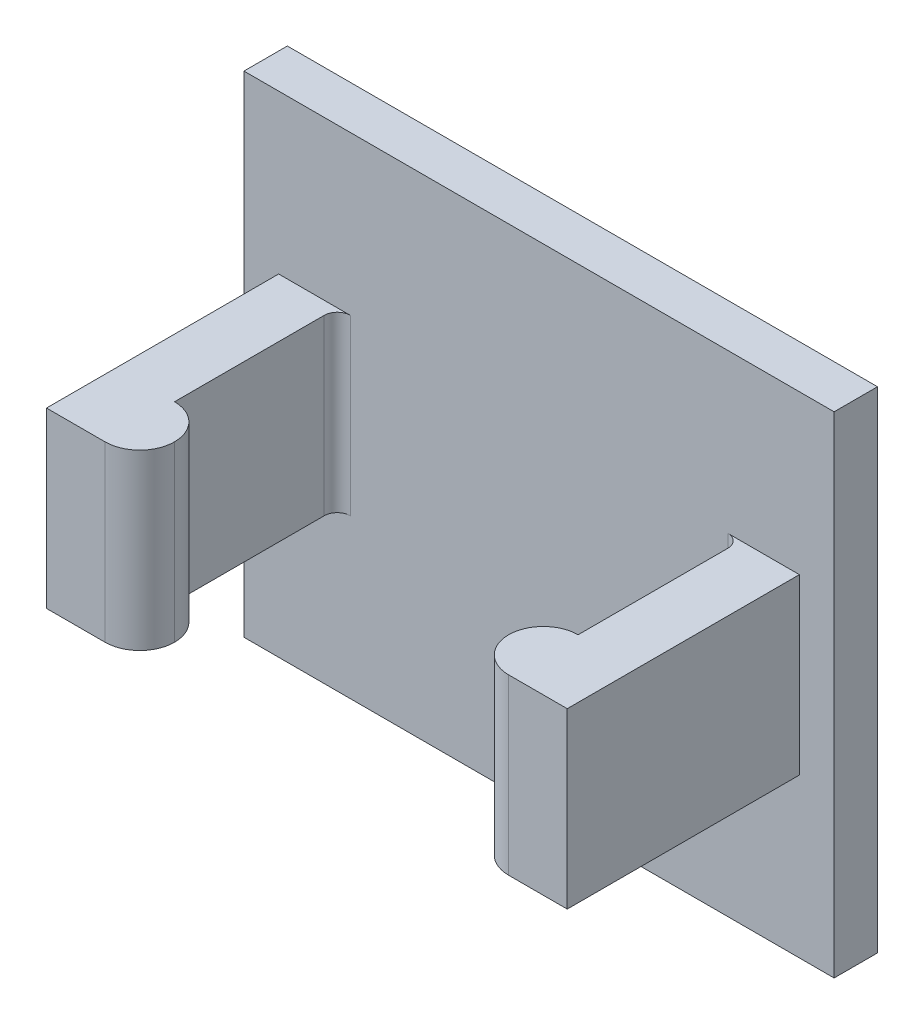
ISO-10303-21;
HEADER;
FILE_DESCRIPTION(('STEP AP214'),'2;1');
FILE_NAME('part.step','',(''),(''),'','','');
FILE_SCHEMA(('AUTOMOTIVE_DESIGN { 1 0 10303 214 1 1 1 1 }'));
ENDSEC;
DATA;
#1=APPLICATION_CONTEXT('core data for automotive mechanical design processes');
#2=APPLICATION_PROTOCOL_DEFINITION('international standard','automotive_design',2000,#1);
#3=PRODUCT_CONTEXT('',#1,'mechanical');
#4=PRODUCT('Part','Part','',(#3));
#5=PRODUCT_RELATED_PRODUCT_CATEGORY('part','',(#4));
#6=PRODUCT_DEFINITION_FORMATION('','',#4);
#7=PRODUCT_DEFINITION_CONTEXT('part definition',#1,'design');
#8=PRODUCT_DEFINITION('design','',#6,#7);
#9=PRODUCT_DEFINITION_SHAPE('','',#8);
#10=(LENGTH_UNIT() NAMED_UNIT(*) SI_UNIT(.MILLI.,.METRE.));
#11=(NAMED_UNIT(*) PLANE_ANGLE_UNIT() SI_UNIT($,.RADIAN.));
#12=(NAMED_UNIT(*) SI_UNIT($,.STERADIAN.) SOLID_ANGLE_UNIT());
#13=UNCERTAINTY_MEASURE_WITH_UNIT(LENGTH_MEASURE(1.E-05),#10,'distance_accuracy_value','');
#14=(GEOMETRIC_REPRESENTATION_CONTEXT(3) GLOBAL_UNCERTAINTY_ASSIGNED_CONTEXT((#13)) GLOBAL_UNIT_ASSIGNED_CONTEXT((#10,
#11,#12)) REPRESENTATION_CONTEXT('',''));
#15=CARTESIAN_POINT('',(0.,0.,0.));
#16=DIRECTION('',(0.,0.,1.));
#17=DIRECTION('',(1.,0.,0.));
#18=AXIS2_PLACEMENT_3D('',#15,#16,#17);
#19=CARTESIAN_POINT('',(6.,-5.65,1.));
#20=DIRECTION('',(-1.,0.,0.));
#21=DIRECTION('',(0.,0.,1.));
#22=AXIS2_PLACEMENT_3D('',#19,#20,#21);
#23=PLANE('',#22);
#24=DIRECTION('',(0.,-1.,0.));
#25=VECTOR('',#24,1.);
#26=CARTESIAN_POINT('',(6.,5.65,1.));
#27=LINE('',#26,#25);
#28=CARTESIAN_POINT('',(6.,2.,1.));
#29=VERTEX_POINT('',#28);
#30=CARTESIAN_POINT('',(6.,-2.,1.));
#31=VERTEX_POINT('',#30);
#32=EDGE_CURVE('E11',#29,#31,#27,.T.);
#33=ORIENTED_EDGE('',*,*,#32,.F.);
#34=DIRECTION('',(0.,0.,-1.));
#35=VECTOR('',#34,1.);
#36=CARTESIAN_POINT('',(6.,2.,6.35));
#37=LINE('',#36,#35);
#38=CARTESIAN_POINT('',(6.,2.,6.35));
#39=VERTEX_POINT('',#38);
#40=EDGE_CURVE('E261',#39,#29,#37,.T.);
#41=ORIENTED_EDGE('',*,*,#40,.F.);
#42=DIRECTION('',(0.,1.,0.));
#43=VECTOR('',#42,1.);
#44=CARTESIAN_POINT('',(6.,2.,6.35));
#45=LINE('',#44,#43);
#46=CARTESIAN_POINT('',(6.,-2.,6.35));
#47=VERTEX_POINT('',#46);
#48=EDGE_CURVE('E232',#47,#39,#45,.T.);
#49=ORIENTED_EDGE('',*,*,#48,.F.);
#50=DIRECTION('',(0.,0.,-1.));
#51=VECTOR('',#50,1.);
#52=CARTESIAN_POINT('',(6.,-2.,6.35));
#53=LINE('',#52,#51);
#54=EDGE_CURVE('E244',#47,#31,#53,.T.);
#55=ORIENTED_EDGE('',*,*,#54,.T.);
#56=EDGE_LOOP('',(#33,#41,#49,#55));
#57=FACE_BOUND('',#56,.T.);
#58=ADVANCED_FACE('F41',(#57),#23,.F.);
#59=CARTESIAN_POINT('',(-6.,-5.65,1.));
#60=DIRECTION('',(1.,0.,0.));
#61=DIRECTION('',(0.,0.,-1.));
#62=AXIS2_PLACEMENT_3D('',#59,#60,#61);
#63=PLANE('',#62);
#64=DIRECTION('',(0.,1.,0.));
#65=VECTOR('',#64,1.);
#66=CARTESIAN_POINT('',(-6.,5.65,1.));
#67=LINE('',#66,#65);
#68=CARTESIAN_POINT('',(-6.,-2.,1.));
#69=VERTEX_POINT('',#68);
#70=CARTESIAN_POINT('',(-6.,2.,1.));
#71=VERTEX_POINT('',#70);
#72=EDGE_CURVE('E51',#69,#71,#67,.T.);
#73=ORIENTED_EDGE('',*,*,#72,.F.);
#74=DIRECTION('',(0.,0.,-1.));
#75=VECTOR('',#74,1.);
#76=CARTESIAN_POINT('',(-6.,-2.,6.35));
#77=LINE('',#76,#75);
#78=CARTESIAN_POINT('',(-6.,-2.,6.35));
#79=VERTEX_POINT('',#78);
#80=EDGE_CURVE('E294',#79,#69,#77,.T.);
#81=ORIENTED_EDGE('',*,*,#80,.F.);
#82=DIRECTION('',(0.,-1.,0.));
#83=VECTOR('',#82,1.);
#84=CARTESIAN_POINT('',(-6.,2.,6.35));
#85=LINE('',#84,#83);
#86=CARTESIAN_POINT('',(-6.,2.,6.35));
#87=VERTEX_POINT('',#86);
#88=EDGE_CURVE('E266',#87,#79,#85,.T.);
#89=ORIENTED_EDGE('',*,*,#88,.F.);
#90=DIRECTION('',(0.,0.,-1.));
#91=VECTOR('',#90,1.);
#92=CARTESIAN_POINT('',(-6.,2.,6.35));
#93=LINE('',#92,#91);
#94=EDGE_CURVE('E278',#87,#71,#93,.T.);
#95=ORIENTED_EDGE('',*,*,#94,.T.);
#96=EDGE_LOOP('',(#73,#81,#89,#95));
#97=FACE_BOUND('',#96,.T.);
#98=ADVANCED_FACE('F374',(#97),#63,.F.);
#99=CARTESIAN_POINT('',(4.65,2.,6.35));
#100=DIRECTION('',(1.,0.,0.));
#101=DIRECTION('',(0.,0.,-1.));
#102=AXIS2_PLACEMENT_3D('',#99,#100,#101);
#103=PLANE('',#102);
#104=DIRECTION('',(0.,0.,-1.));
#105=VECTOR('',#104,1.);
#106=CARTESIAN_POINT('',(4.65,2.,6.35));
#107=LINE('',#106,#105);
#108=CARTESIAN_POINT('',(4.65,2.,4.75));
#109=VERTEX_POINT('',#108);
#110=CARTESIAN_POINT('',(4.65,2.,1.3));
#111=VERTEX_POINT('',#110);
#112=EDGE_CURVE('E257',#109,#111,#107,.T.);
#113=ORIENTED_EDGE('',*,*,#112,.T.);
#114=DIRECTION('',(0.,-1.,0.));
#115=VECTOR('',#114,1.);
#116=CARTESIAN_POINT('',(4.65,-2.,1.3));
#117=LINE('',#116,#115);
#118=CARTESIAN_POINT('',(4.65,-2.,1.3));
#119=VERTEX_POINT('',#118);
#120=EDGE_CURVE('E336',#111,#119,#117,.T.);
#121=ORIENTED_EDGE('',*,*,#120,.T.);
#122=DIRECTION('',(0.,0.,-1.));
#123=VECTOR('',#122,1.);
#124=CARTESIAN_POINT('',(4.65,-2.,6.35));
#125=LINE('',#124,#123);
#126=CARTESIAN_POINT('',(4.65,-2.,4.75));
#127=VERTEX_POINT('',#126);
#128=EDGE_CURVE('E253',#127,#119,#125,.T.);
#129=ORIENTED_EDGE('',*,*,#128,.F.);
#130=DIRECTION('',(0.,-1.,0.));
#131=VECTOR('',#130,1.);
#132=CARTESIAN_POINT('',(4.65,2.,4.75));
#133=LINE('',#132,#131);
#134=EDGE_CURVE('E222',#109,#127,#133,.T.);
#135=ORIENTED_EDGE('',*,*,#134,.F.);
#136=EDGE_LOOP('',(#113,#121,#129,#135));
#137=FACE_BOUND('',#136,.T.);
#138=ADVANCED_FACE('F408',(#137),#103,.F.);
#139=CARTESIAN_POINT('',(-4.65,2.,6.35));
#140=DIRECTION('',(-1.,0.,0.));
#141=DIRECTION('',(0.,0.,1.));
#142=AXIS2_PLACEMENT_3D('',#139,#140,#141);
#143=PLANE('',#142);
#144=DIRECTION('',(0.,0.,-1.));
#145=VECTOR('',#144,1.);
#146=CARTESIAN_POINT('',(-4.65,-2.,6.35));
#147=LINE('',#146,#145);
#148=CARTESIAN_POINT('',(-4.65,-2.,4.75));
#149=VERTEX_POINT('',#148);
#150=CARTESIAN_POINT('',(-4.65,-2.,1.3));
#151=VERTEX_POINT('',#150);
#152=EDGE_CURVE('E291',#149,#151,#147,.T.);
#153=ORIENTED_EDGE('',*,*,#152,.T.);
#154=DIRECTION('',(0.,1.,0.));
#155=VECTOR('',#154,1.);
#156=CARTESIAN_POINT('',(-4.65,2.,1.3));
#157=LINE('',#156,#155);
#158=CARTESIAN_POINT('',(-4.65,2.,1.3));
#159=VERTEX_POINT('',#158);
#160=EDGE_CURVE('E354',#151,#159,#157,.T.);
#161=ORIENTED_EDGE('',*,*,#160,.T.);
#162=DIRECTION('',(0.,0.,-1.));
#163=VECTOR('',#162,1.);
#164=CARTESIAN_POINT('',(-4.65,2.,6.35));
#165=LINE('',#164,#163);
#166=CARTESIAN_POINT('',(-4.65,2.,4.75));
#167=VERTEX_POINT('',#166);
#168=EDGE_CURVE('E287',#167,#159,#165,.T.);
#169=ORIENTED_EDGE('',*,*,#168,.F.);
#170=DIRECTION('',(0.,1.,0.));
#171=VECTOR('',#170,1.);
#172=CARTESIAN_POINT('',(-4.65,2.,4.75));
#173=LINE('',#172,#171);
#174=EDGE_CURVE('E226',#149,#167,#173,.T.);
#175=ORIENTED_EDGE('',*,*,#174,.F.);
#176=EDGE_LOOP('',(#153,#161,#169,#175));
#177=FACE_BOUND('',#176,.T.);
#178=ADVANCED_FACE('F388',(#177),#143,.F.);
#179=CARTESIAN_POINT('',(0.,0.,1.));
#180=DIRECTION('',(0.,0.,-1.));
#181=DIRECTION('',(-1.,0.,0.));
#182=AXIS2_PLACEMENT_3D('',#179,#180,#181);
#183=PLANE('',#182);
#184=DIRECTION('',(0.,-1.,0.));
#185=VECTOR('',#184,1.);
#186=CARTESIAN_POINT('',(6.8,5.65,1.));
#187=LINE('',#186,#185);
#188=CARTESIAN_POINT('',(6.8,5.65,1.));
#189=VERTEX_POINT('',#188);
#190=CARTESIAN_POINT('',(6.8,-5.65,1.));
#191=VERTEX_POINT('',#190);
#192=EDGE_CURVE('E175',#189,#191,#187,.T.);
#193=ORIENTED_EDGE('',*,*,#192,.F.);
#194=DIRECTION('',(-1.,0.,0.));
#195=VECTOR('',#194,1.);
#196=CARTESIAN_POINT('',(-6.,5.65,1.));
#197=LINE('',#196,#195);
#198=CARTESIAN_POINT('',(-6.8,5.65,1.));
#199=VERTEX_POINT('',#198);
#200=EDGE_CURVE('E183',#189,#199,#197,.T.);
#201=ORIENTED_EDGE('',*,*,#200,.T.);
#202=DIRECTION('',(0.,1.,0.));
#203=VECTOR('',#202,1.);
#204=CARTESIAN_POINT('',(-6.8,5.65,1.));
#205=LINE('',#204,#203);
#206=CARTESIAN_POINT('',(-6.8,-5.65,1.));
#207=VERTEX_POINT('',#206);
#208=EDGE_CURVE('E177',#207,#199,#205,.T.);
#209=ORIENTED_EDGE('',*,*,#208,.F.);
#210=DIRECTION('',(1.,0.,0.));
#211=VECTOR('',#210,1.);
#212=CARTESIAN_POINT('',(-6.,-5.65,1.));
#213=LINE('',#212,#211);
#214=EDGE_CURVE('E170',#207,#191,#213,.T.);
#215=ORIENTED_EDGE('',*,*,#214,.T.);
#216=EDGE_LOOP('',(#193,#201,#209,#215));
#217=FACE_BOUND('',#216,.T.);
#218=DIRECTION('',(-1.,0.,0.));
#219=VECTOR('',#218,1.);
#220=CARTESIAN_POINT('',(6.,2.,1.));
#221=LINE('',#220,#219);
#222=CARTESIAN_POINT('',(4.35,2.,1.));
#223=VERTEX_POINT('',#222);
#224=EDGE_CURVE('E231',#29,#223,#221,.T.);
#225=ORIENTED_EDGE('',*,*,#224,.F.);
#226=ORIENTED_EDGE('',*,*,#32,.T.);
#227=DIRECTION('',(1.,0.,0.));
#228=VECTOR('',#227,1.);
#229=CARTESIAN_POINT('',(6.,-2.,1.));
#230=LINE('',#229,#228);
#231=CARTESIAN_POINT('',(4.35,-2.,1.));
#232=VERTEX_POINT('',#231);
#233=EDGE_CURVE('E237',#232,#31,#230,.T.);
#234=ORIENTED_EDGE('',*,*,#233,.F.);
#235=DIRECTION('',(0.,-1.,0.));
#236=VECTOR('',#235,1.);
#237=CARTESIAN_POINT('',(4.35,2.,1.));
#238=LINE('',#237,#236);
#239=EDGE_CURVE('E350',#232,#223,#238,.F.);
#240=ORIENTED_EDGE('',*,*,#239,.T.);
#241=EDGE_LOOP('',(#225,#226,#234,#240));
#242=FACE_BOUND('',#241,.T.);
#243=DIRECTION('',(1.,0.,0.));
#244=VECTOR('',#243,1.);
#245=CARTESIAN_POINT('',(-6.,-2.,1.));
#246=LINE('',#245,#244);
#247=CARTESIAN_POINT('',(-4.35,-2.,1.));
#248=VERTEX_POINT('',#247);
#249=EDGE_CURVE('E265',#69,#248,#246,.T.);
#250=ORIENTED_EDGE('',*,*,#249,.F.);
#251=ORIENTED_EDGE('',*,*,#72,.T.);
#252=DIRECTION('',(-1.,0.,0.));
#253=VECTOR('',#252,1.);
#254=CARTESIAN_POINT('',(-6.,2.,1.));
#255=LINE('',#254,#253);
#256=CARTESIAN_POINT('',(-4.35,2.,1.));
#257=VERTEX_POINT('',#256);
#258=EDGE_CURVE('E271',#257,#71,#255,.T.);
#259=ORIENTED_EDGE('',*,*,#258,.F.);
#260=DIRECTION('',(0.,1.,0.));
#261=VECTOR('',#260,1.);
#262=CARTESIAN_POINT('',(-4.35,-2.,1.));
#263=LINE('',#262,#261);
#264=EDGE_CURVE('E346',#257,#248,#263,.F.);
#265=ORIENTED_EDGE('',*,*,#264,.T.);
#266=EDGE_LOOP('',(#250,#251,#259,#265));
#267=FACE_BOUND('',#266,.T.);
#268=ADVANCED_FACE('F172',(#217,#242,#267),#183,.F.);
#269=CARTESIAN_POINT('',(-6.,5.65,1.));
#270=DIRECTION('',(0.,-1.,0.));
#271=DIRECTION('',(0.,0.,-1.));
#272=AXIS2_PLACEMENT_3D('',#269,#270,#271);
#273=PLANE('',#272);
#274=DIRECTION('',(-1.,0.,0.));
#275=VECTOR('',#274,1.);
#276=CARTESIAN_POINT('',(-6.,5.65,0.));
#277=LINE('',#276,#275);
#278=CARTESIAN_POINT('',(6.8,5.65,0.));
#279=VERTEX_POINT('',#278);
#280=CARTESIAN_POINT('',(-6.8,5.65,0.));
#281=VERTEX_POINT('',#280);
#282=EDGE_CURVE('E298',#279,#281,#277,.T.);
#283=ORIENTED_EDGE('',*,*,#282,.T.);
#284=DIRECTION('',(0.,0.,-1.));
#285=VECTOR('',#284,1.);
#286=CARTESIAN_POINT('',(-6.8,5.65,0.));
#287=LINE('',#286,#285);
#288=EDGE_CURVE('E215',#199,#281,#287,.T.);
#289=ORIENTED_EDGE('',*,*,#288,.F.);
#290=ORIENTED_EDGE('',*,*,#200,.F.);
#291=DIRECTION('',(0.,0.,1.));
#292=VECTOR('',#291,1.);
#293=CARTESIAN_POINT('',(6.8,5.65,1.));
#294=LINE('',#293,#292);
#295=EDGE_CURVE('E198',#279,#189,#294,.T.);
#296=ORIENTED_EDGE('',*,*,#295,.F.);
#297=EDGE_LOOP('',(#283,#289,#290,#296));
#298=FACE_BOUND('',#297,.T.);
#299=ADVANCED_FACE('F412',(#298),#273,.F.);
#300=CARTESIAN_POINT('',(-6.,-5.65,1.));
#301=DIRECTION('',(0.,1.,0.));
#302=DIRECTION('',(0.,0.,1.));
#303=AXIS2_PLACEMENT_3D('',#300,#301,#302);
#304=PLANE('',#303);
#305=DIRECTION('',(1.,0.,0.));
#306=VECTOR('',#305,1.);
#307=CARTESIAN_POINT('',(-6.,-5.65,0.));
#308=LINE('',#307,#306);
#309=CARTESIAN_POINT('',(-6.8,-5.65,0.));
#310=VERTEX_POINT('',#309);
#311=CARTESIAN_POINT('',(6.8,-5.65,0.));
#312=VERTEX_POINT('',#311);
#313=EDGE_CURVE('E188',#310,#312,#308,.T.);
#314=ORIENTED_EDGE('',*,*,#313,.T.);
#315=DIRECTION('',(0.,0.,-1.));
#316=VECTOR('',#315,1.);
#317=CARTESIAN_POINT('',(6.8,-5.65,1.));
#318=LINE('',#317,#316);
#319=EDGE_CURVE('E186',#191,#312,#318,.T.);
#320=ORIENTED_EDGE('',*,*,#319,.F.);
#321=ORIENTED_EDGE('',*,*,#214,.F.);
#322=DIRECTION('',(0.,0.,1.));
#323=VECTOR('',#322,1.);
#324=CARTESIAN_POINT('',(-6.8,-5.65,0.));
#325=LINE('',#324,#323);
#326=EDGE_CURVE('E210',#310,#207,#325,.T.);
#327=ORIENTED_EDGE('',*,*,#326,.F.);
#328=EDGE_LOOP('',(#314,#320,#321,#327));
#329=FACE_BOUND('',#328,.T.);
#330=ADVANCED_FACE('F187',(#329),#304,.F.);
#331=CARTESIAN_POINT('',(0.,0.,0.));
#332=DIRECTION('',(0.,0.,-1.));
#333=DIRECTION('',(-1.,0.,0.));
#334=AXIS2_PLACEMENT_3D('',#331,#332,#333);
#335=PLANE('',#334);
#336=ORIENTED_EDGE('',*,*,#282,.F.);
#337=DIRECTION('',(0.,1.,0.));
#338=VECTOR('',#337,1.);
#339=CARTESIAN_POINT('',(6.8,5.65,0.));
#340=LINE('',#339,#338);
#341=EDGE_CURVE('E193',#312,#279,#340,.T.);
#342=ORIENTED_EDGE('',*,*,#341,.F.);
#343=ORIENTED_EDGE('',*,*,#313,.F.);
#344=DIRECTION('',(0.,-1.,0.));
#345=VECTOR('',#344,1.);
#346=CARTESIAN_POINT('',(-6.8,5.65,0.));
#347=LINE('',#346,#345);
#348=EDGE_CURVE('E205',#281,#310,#347,.T.);
#349=ORIENTED_EDGE('',*,*,#348,.F.);
#350=EDGE_LOOP('',(#336,#342,#343,#349));
#351=FACE_BOUND('',#350,.T.);
#352=ADVANCED_FACE('F391',(#351),#335,.T.);
#353=CARTESIAN_POINT('',(-6.,-2.,6.35));
#354=DIRECTION('',(0.,1.,0.));
#355=DIRECTION('',(0.,0.,1.));
#356=AXIS2_PLACEMENT_3D('',#353,#354,#355);
#357=PLANE('',#356);
#358=CARTESIAN_POINT('',(-4.65,-2.,5.55));
#359=DIRECTION('',(0.,1.,0.));
#360=DIRECTION('',(0.,0.,1.));
#361=AXIS2_PLACEMENT_3D('',#358,#359,#360);
#362=CIRCLE('',#361,0.8);
#363=CARTESIAN_POINT('',(-3.85,-2.,5.55));
#364=VERTEX_POINT('',#363);
#365=EDGE_CURVE('E320',#149,#364,#362,.F.);
#366=ORIENTED_EDGE('',*,*,#365,.T.);
#367=CARTESIAN_POINT('',(-4.65,-2.,5.55));
#368=DIRECTION('',(0.,1.,0.));
#369=DIRECTION('',(0.,0.,1.));
#370=AXIS2_PLACEMENT_3D('',#367,#368,#369);
#371=CIRCLE('',#370,0.8);
#372=CARTESIAN_POINT('',(-4.65,-2.,6.35));
#373=VERTEX_POINT('',#372);
#374=EDGE_CURVE('E323',#364,#373,#371,.F.);
#375=ORIENTED_EDGE('',*,*,#374,.T.);
#376=DIRECTION('',(1.,0.,0.));
#377=VECTOR('',#376,1.);
#378=CARTESIAN_POINT('',(-6.,-2.,6.35));
#379=LINE('',#378,#377);
#380=EDGE_CURVE('E270',#79,#373,#379,.T.);
#381=ORIENTED_EDGE('',*,*,#380,.F.);
#382=ORIENTED_EDGE('',*,*,#80,.T.);
#383=ORIENTED_EDGE('',*,*,#249,.T.);
#384=CARTESIAN_POINT('',(-4.35,-2.,1.3));
#385=DIRECTION('',(0.,1.,0.));
#386=DIRECTION('',(0.,0.,1.));
#387=AXIS2_PLACEMENT_3D('',#384,#385,#386);
#388=CIRCLE('',#387,0.3);
#389=EDGE_CURVE('E45',#248,#151,#388,.T.);
#390=ORIENTED_EDGE('',*,*,#389,.T.);
#391=ORIENTED_EDGE('',*,*,#152,.F.);
#392=EDGE_LOOP('',(#366,#375,#381,#382,#383,#390,#391));
#393=FACE_BOUND('',#392,.T.);
#394=ADVANCED_FACE('F389',(#393),#357,.F.);
#395=CARTESIAN_POINT('',(-6.,2.,6.35));
#396=DIRECTION('',(0.,-1.,0.));
#397=DIRECTION('',(0.,0.,-1.));
#398=AXIS2_PLACEMENT_3D('',#395,#396,#397);
#399=PLANE('',#398);
#400=DIRECTION('',(-1.,0.,0.));
#401=VECTOR('',#400,1.);
#402=CARTESIAN_POINT('',(-6.,2.,6.35));
#403=LINE('',#402,#401);
#404=CARTESIAN_POINT('',(-4.65,2.,6.35));
#405=VERTEX_POINT('',#404);
#406=EDGE_CURVE('E275',#405,#87,#403,.T.);
#407=ORIENTED_EDGE('',*,*,#406,.F.);
#408=CARTESIAN_POINT('',(-4.65,2.,5.55));
#409=DIRECTION('',(0.,-1.,0.));
#410=DIRECTION('',(0.,0.,-1.));
#411=AXIS2_PLACEMENT_3D('',#408,#409,#410);
#412=CIRCLE('',#411,0.8);
#413=CARTESIAN_POINT('',(-3.85,2.,5.55));
#414=VERTEX_POINT('',#413);
#415=EDGE_CURVE('E333',#405,#414,#412,.F.);
#416=ORIENTED_EDGE('',*,*,#415,.T.);
#417=CARTESIAN_POINT('',(-4.65,2.,5.55));
#418=DIRECTION('',(0.,-1.,0.));
#419=DIRECTION('',(0.,0.,-1.));
#420=AXIS2_PLACEMENT_3D('',#417,#418,#419);
#421=CIRCLE('',#420,0.8);
#422=EDGE_CURVE('E330',#414,#167,#421,.F.);
#423=ORIENTED_EDGE('',*,*,#422,.T.);
#424=ORIENTED_EDGE('',*,*,#168,.T.);
#425=CARTESIAN_POINT('',(-4.35,2.,1.3));
#426=DIRECTION('',(0.,-1.,0.));
#427=DIRECTION('',(0.,0.,-1.));
#428=AXIS2_PLACEMENT_3D('',#425,#426,#427);
#429=CIRCLE('',#428,0.3);
#430=EDGE_CURVE('E59',#159,#257,#429,.T.);
#431=ORIENTED_EDGE('',*,*,#430,.T.);
#432=ORIENTED_EDGE('',*,*,#258,.T.);
#433=ORIENTED_EDGE('',*,*,#94,.F.);
#434=EDGE_LOOP('',(#407,#416,#423,#424,#431,#432,#433));
#435=FACE_BOUND('',#434,.T.);
#436=ADVANCED_FACE('F367',(#435),#399,.F.);
#437=CARTESIAN_POINT('',(0.,0.,6.35));
#438=DIRECTION('',(0.,0.,1.));
#439=DIRECTION('',(1.,0.,0.));
#440=AXIS2_PLACEMENT_3D('',#437,#438,#439);
#441=PLANE('',#440);
#442=ORIENTED_EDGE('',*,*,#380,.T.);
#443=DIRECTION('',(0.,-1.,0.));
#444=VECTOR('',#443,1.);
#445=CARTESIAN_POINT('',(-4.65,0.,6.35));
#446=LINE('',#445,#444);
#447=EDGE_CURVE('E326',#373,#405,#446,.F.);
#448=ORIENTED_EDGE('',*,*,#447,.T.);
#449=ORIENTED_EDGE('',*,*,#406,.T.);
#450=ORIENTED_EDGE('',*,*,#88,.T.);
#451=EDGE_LOOP('',(#442,#448,#449,#450));
#452=FACE_BOUND('',#451,.T.);
#453=ADVANCED_FACE('F378',(#452),#441,.T.);
#454=CARTESIAN_POINT('',(6.,2.,6.35));
#455=DIRECTION('',(0.,-1.,0.));
#456=DIRECTION('',(0.,0.,-1.));
#457=AXIS2_PLACEMENT_3D('',#454,#455,#456);
#458=PLANE('',#457);
#459=CARTESIAN_POINT('',(4.65,2.,5.55));
#460=DIRECTION('',(0.,-1.,0.));
#461=DIRECTION('',(0.,0.,-1.));
#462=AXIS2_PLACEMENT_3D('',#459,#460,#461);
#463=CIRCLE('',#462,0.8);
#464=CARTESIAN_POINT('',(3.85,2.,5.55));
#465=VERTEX_POINT('',#464);
#466=EDGE_CURVE('E182',#109,#465,#463,.F.);
#467=ORIENTED_EDGE('',*,*,#466,.T.);
#468=CARTESIAN_POINT('',(4.65,2.,5.55));
#469=DIRECTION('',(0.,-1.,0.));
#470=DIRECTION('',(0.,0.,-1.));
#471=AXIS2_PLACEMENT_3D('',#468,#469,#470);
#472=CIRCLE('',#471,0.8);
#473=CARTESIAN_POINT('',(4.65,2.,6.35));
#474=VERTEX_POINT('',#473);
#475=EDGE_CURVE('E307',#465,#474,#472,.F.);
#476=ORIENTED_EDGE('',*,*,#475,.T.);
#477=DIRECTION('',(-1.,0.,0.));
#478=VECTOR('',#477,1.);
#479=CARTESIAN_POINT('',(6.,2.,6.35));
#480=LINE('',#479,#478);
#481=EDGE_CURVE('E236',#39,#474,#480,.T.);
#482=ORIENTED_EDGE('',*,*,#481,.F.);
#483=ORIENTED_EDGE('',*,*,#40,.T.);
#484=ORIENTED_EDGE('',*,*,#224,.T.);
#485=CARTESIAN_POINT('',(4.35,2.,1.3));
#486=DIRECTION('',(0.,-1.,0.));
#487=DIRECTION('',(0.,0.,-1.));
#488=AXIS2_PLACEMENT_3D('',#485,#486,#487);
#489=CIRCLE('',#488,0.3);
#490=EDGE_CURVE('E361',#223,#111,#489,.T.);
#491=ORIENTED_EDGE('',*,*,#490,.T.);
#492=ORIENTED_EDGE('',*,*,#112,.F.);
#493=EDGE_LOOP('',(#467,#476,#482,#483,#484,#491,#492));
#494=FACE_BOUND('',#493,.T.);
#495=ADVANCED_FACE('F437',(#494),#458,.F.);
#496=CARTESIAN_POINT('',(6.,-2.,6.35));
#497=DIRECTION('',(0.,1.,0.));
#498=DIRECTION('',(0.,0.,1.));
#499=AXIS2_PLACEMENT_3D('',#496,#497,#498);
#500=PLANE('',#499);
#501=DIRECTION('',(1.,0.,0.));
#502=VECTOR('',#501,1.);
#503=CARTESIAN_POINT('',(6.,-2.,6.35));
#504=LINE('',#503,#502);
#505=CARTESIAN_POINT('',(4.65,-2.,6.35));
#506=VERTEX_POINT('',#505);
#507=EDGE_CURVE('E241',#506,#47,#504,.T.);
#508=ORIENTED_EDGE('',*,*,#507,.F.);
#509=CARTESIAN_POINT('',(4.65,-2.,5.55));
#510=DIRECTION('',(0.,1.,0.));
#511=DIRECTION('',(0.,0.,1.));
#512=AXIS2_PLACEMENT_3D('',#509,#510,#511);
#513=CIRCLE('',#512,0.8);
#514=CARTESIAN_POINT('',(3.85,-2.,5.55));
#515=VERTEX_POINT('',#514);
#516=EDGE_CURVE('E317',#506,#515,#513,.F.);
#517=ORIENTED_EDGE('',*,*,#516,.T.);
#518=CARTESIAN_POINT('',(4.65,-2.,5.55));
#519=DIRECTION('',(0.,1.,0.));
#520=DIRECTION('',(0.,0.,1.));
#521=AXIS2_PLACEMENT_3D('',#518,#519,#520);
#522=CIRCLE('',#521,0.8);
#523=EDGE_CURVE('E314',#515,#127,#522,.F.);
#524=ORIENTED_EDGE('',*,*,#523,.T.);
#525=ORIENTED_EDGE('',*,*,#128,.T.);
#526=CARTESIAN_POINT('',(4.35,-2.,1.3));
#527=DIRECTION('',(0.,1.,0.));
#528=DIRECTION('',(0.,0.,1.));
#529=AXIS2_PLACEMENT_3D('',#526,#527,#528);
#530=CIRCLE('',#529,0.3);
#531=EDGE_CURVE('E357',#119,#232,#530,.T.);
#532=ORIENTED_EDGE('',*,*,#531,.T.);
#533=ORIENTED_EDGE('',*,*,#233,.T.);
#534=ORIENTED_EDGE('',*,*,#54,.F.);
#535=EDGE_LOOP('',(#508,#517,#524,#525,#532,#533,#534));
#536=FACE_BOUND('',#535,.T.);
#537=ADVANCED_FACE('F451',(#536),#500,.F.);
#538=CARTESIAN_POINT('',(0.,0.,6.35));
#539=DIRECTION('',(0.,0.,-1.));
#540=DIRECTION('',(-1.,0.,0.));
#541=AXIS2_PLACEMENT_3D('',#538,#539,#540);
#542=PLANE('',#541);
#543=ORIENTED_EDGE('',*,*,#481,.T.);
#544=DIRECTION('',(0.,1.,0.));
#545=VECTOR('',#544,1.);
#546=CARTESIAN_POINT('',(4.65,0.,6.35));
#547=LINE('',#546,#545);
#548=EDGE_CURVE('E310',#474,#506,#547,.F.);
#549=ORIENTED_EDGE('',*,*,#548,.T.);
#550=ORIENTED_EDGE('',*,*,#507,.T.);
#551=ORIENTED_EDGE('',*,*,#48,.T.);
#552=EDGE_LOOP('',(#543,#549,#550,#551));
#553=FACE_BOUND('',#552,.T.);
#554=ADVANCED_FACE('F420',(#553),#542,.F.);
#555=CARTESIAN_POINT('',(4.65,0.,5.55));
#556=DIRECTION('',(0.,-1.,0.));
#557=DIRECTION('',(0.,0.,-1.));
#558=AXIS2_PLACEMENT_3D('',#555,#556,#557);
#559=CYLINDRICAL_SURFACE('',#558,0.8);
#560=ORIENTED_EDGE('',*,*,#134,.T.);
#561=ORIENTED_EDGE('',*,*,#523,.F.);
#562=DIRECTION('',(0.,-1.,0.));
#563=VECTOR('',#562,1.);
#564=CARTESIAN_POINT('',(3.85,0.,5.55));
#565=LINE('',#564,#563);
#566=EDGE_CURVE('E227',#465,#515,#565,.T.);
#567=ORIENTED_EDGE('',*,*,#566,.F.);
#568=ORIENTED_EDGE('',*,*,#466,.F.);
#569=EDGE_LOOP('',(#560,#561,#567,#568));
#570=FACE_BOUND('',#569,.T.);
#571=ADVANCED_FACE('F416',(#570),#559,.T.);
#572=CARTESIAN_POINT('',(4.65,0.,5.55));
#573=DIRECTION('',(0.,1.,0.));
#574=DIRECTION('',(0.,0.,1.));
#575=AXIS2_PLACEMENT_3D('',#572,#573,#574);
#576=CYLINDRICAL_SURFACE('',#575,0.8);
#577=ORIENTED_EDGE('',*,*,#516,.F.);
#578=ORIENTED_EDGE('',*,*,#548,.F.);
#579=ORIENTED_EDGE('',*,*,#475,.F.);
#580=ORIENTED_EDGE('',*,*,#566,.T.);
#581=EDGE_LOOP('',(#577,#578,#579,#580));
#582=FACE_BOUND('',#581,.T.);
#583=ADVANCED_FACE('F413',(#582),#576,.T.);
#584=CARTESIAN_POINT('',(-4.65,0.,5.55));
#585=DIRECTION('',(0.,-1.,0.));
#586=DIRECTION('',(0.,0.,-1.));
#587=AXIS2_PLACEMENT_3D('',#584,#585,#586);
#588=CYLINDRICAL_SURFACE('',#587,0.8);
#589=ORIENTED_EDGE('',*,*,#174,.T.);
#590=ORIENTED_EDGE('',*,*,#422,.F.);
#591=DIRECTION('',(0.,1.,0.));
#592=VECTOR('',#591,1.);
#593=CARTESIAN_POINT('',(-3.85,2.,5.55));
#594=LINE('',#593,#592);
#595=EDGE_CURVE('E219',#364,#414,#594,.T.);
#596=ORIENTED_EDGE('',*,*,#595,.F.);
#597=ORIENTED_EDGE('',*,*,#365,.F.);
#598=EDGE_LOOP('',(#589,#590,#596,#597));
#599=FACE_BOUND('',#598,.T.);
#600=ADVANCED_FACE('F386',(#599),#588,.T.);
#601=CARTESIAN_POINT('',(-4.65,0.,5.55));
#602=DIRECTION('',(0.,-1.,0.));
#603=DIRECTION('',(0.,0.,-1.));
#604=AXIS2_PLACEMENT_3D('',#601,#602,#603);
#605=CYLINDRICAL_SURFACE('',#604,0.8);
#606=ORIENTED_EDGE('',*,*,#415,.F.);
#607=ORIENTED_EDGE('',*,*,#447,.F.);
#608=ORIENTED_EDGE('',*,*,#374,.F.);
#609=ORIENTED_EDGE('',*,*,#595,.T.);
#610=EDGE_LOOP('',(#606,#607,#608,#609));
#611=FACE_BOUND('',#610,.T.);
#612=ADVANCED_FACE('F382',(#611),#605,.T.);
#613=CARTESIAN_POINT('',(4.35,2.,1.3));
#614=DIRECTION('',(0.,1.,0.));
#615=DIRECTION('',(0.,0.,1.));
#616=AXIS2_PLACEMENT_3D('',#613,#614,#615);
#617=CYLINDRICAL_SURFACE('',#616,0.3);
#618=ORIENTED_EDGE('',*,*,#490,.F.);
#619=ORIENTED_EDGE('',*,*,#239,.F.);
#620=ORIENTED_EDGE('',*,*,#531,.F.);
#621=ORIENTED_EDGE('',*,*,#120,.F.);
#622=EDGE_LOOP('',(#618,#619,#620,#621));
#623=FACE_BOUND('',#622,.T.);
#624=ADVANCED_FACE('F424',(#623),#617,.F.);
#625=CARTESIAN_POINT('',(-4.35,2.,1.3));
#626=DIRECTION('',(0.,-1.,0.));
#627=DIRECTION('',(0.,0.,-1.));
#628=AXIS2_PLACEMENT_3D('',#625,#626,#627);
#629=CYLINDRICAL_SURFACE('',#628,0.3);
#630=ORIENTED_EDGE('',*,*,#389,.F.);
#631=ORIENTED_EDGE('',*,*,#264,.F.);
#632=ORIENTED_EDGE('',*,*,#430,.F.);
#633=ORIENTED_EDGE('',*,*,#160,.F.);
#634=EDGE_LOOP('',(#630,#631,#632,#633));
#635=FACE_BOUND('',#634,.T.);
#636=ADVANCED_FACE('F43',(#635),#629,.F.);
#637=CARTESIAN_POINT('',(-6.8,0.,0.));
#638=DIRECTION('',(-1.,0.,0.));
#639=DIRECTION('',(0.,0.,1.));
#640=AXIS2_PLACEMENT_3D('',#637,#638,#639);
#641=PLANE('',#640);
#642=ORIENTED_EDGE('',*,*,#348,.T.);
#643=ORIENTED_EDGE('',*,*,#326,.T.);
#644=ORIENTED_EDGE('',*,*,#208,.T.);
#645=ORIENTED_EDGE('',*,*,#288,.T.);
#646=EDGE_LOOP('',(#642,#643,#644,#645));
#647=FACE_BOUND('',#646,.T.);
#648=ADVANCED_FACE('F431',(#647),#641,.T.);
#649=CARTESIAN_POINT('',(6.8,0.,0.));
#650=DIRECTION('',(1.,0.,0.));
#651=DIRECTION('',(0.,0.,-1.));
#652=AXIS2_PLACEMENT_3D('',#649,#650,#651);
#653=PLANE('',#652);
#654=ORIENTED_EDGE('',*,*,#192,.T.);
#655=ORIENTED_EDGE('',*,*,#319,.T.);
#656=ORIENTED_EDGE('',*,*,#341,.T.);
#657=ORIENTED_EDGE('',*,*,#295,.T.);
#658=EDGE_LOOP('',(#654,#655,#656,#657));
#659=FACE_BOUND('',#658,.T.);
#660=ADVANCED_FACE('F196',(#659),#653,.T.);
#661=CLOSED_SHELL('',(#58,#98,#138,#178,#268,#299,#330,#352,#394,#436,#453,#495,#537,#554,#571,
#583,#600,#612,#624,#636,#648,#660));
#662=MANIFOLD_SOLID_BREP('B2',#661);
#663=ADVANCED_BREP_SHAPE_REPRESENTATION('',(#18,#662),#14);
#664=SHAPE_DEFINITION_REPRESENTATION(#9,#663);
ENDSEC;
END-ISO-10303-21;
